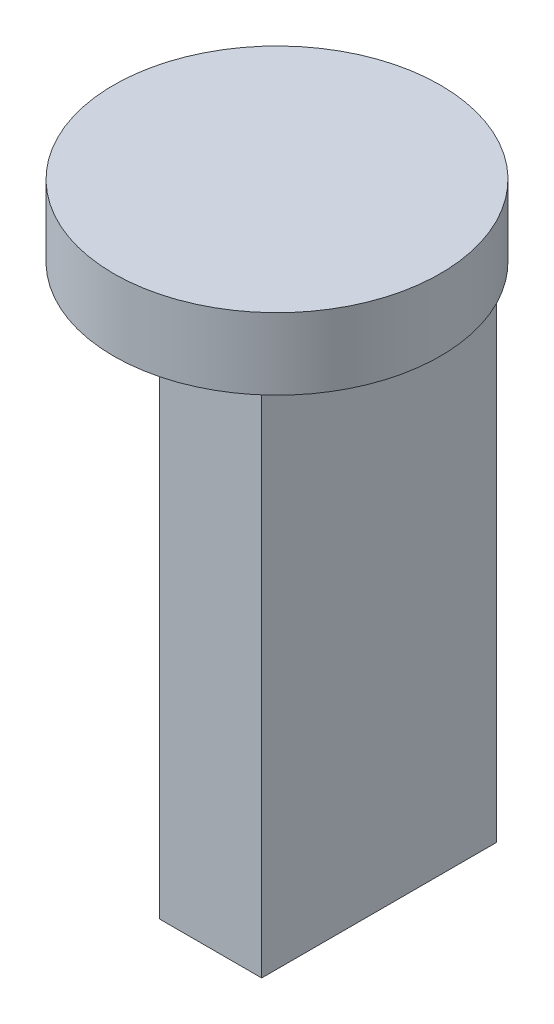
ISO-10303-21;
HEADER;
FILE_DESCRIPTION(('STEP AP214'),'2;1');
FILE_NAME('part.step','',(''),(''),'','','');
FILE_SCHEMA(('AUTOMOTIVE_DESIGN { 1 0 10303 214 1 1 1 1 }'));
ENDSEC;
DATA;
#1=APPLICATION_CONTEXT('core data for automotive mechanical design processes');
#2=APPLICATION_PROTOCOL_DEFINITION('international standard','automotive_design',2000,#1);
#3=PRODUCT_CONTEXT('',#1,'mechanical');
#4=PRODUCT('Part','Part','',(#3));
#5=PRODUCT_RELATED_PRODUCT_CATEGORY('part','',(#4));
#6=PRODUCT_DEFINITION_FORMATION('','',#4);
#7=PRODUCT_DEFINITION_CONTEXT('part definition',#1,'design');
#8=PRODUCT_DEFINITION('design','',#6,#7);
#9=PRODUCT_DEFINITION_SHAPE('','',#8);
#10=(LENGTH_UNIT() NAMED_UNIT(*) SI_UNIT(.MILLI.,.METRE.));
#11=(NAMED_UNIT(*) PLANE_ANGLE_UNIT() SI_UNIT($,.RADIAN.));
#12=(NAMED_UNIT(*) SI_UNIT($,.STERADIAN.) SOLID_ANGLE_UNIT());
#13=UNCERTAINTY_MEASURE_WITH_UNIT(LENGTH_MEASURE(1.E-05),#10,'distance_accuracy_value','');
#14=(GEOMETRIC_REPRESENTATION_CONTEXT(3) GLOBAL_UNCERTAINTY_ASSIGNED_CONTEXT((#13)) GLOBAL_UNIT_ASSIGNED_CONTEXT((#10,
#11,#12)) REPRESENTATION_CONTEXT('',''));
#15=CARTESIAN_POINT('',(0.,0.,0.));
#16=DIRECTION('',(0.,0.,1.));
#17=DIRECTION('',(1.,0.,0.));
#18=AXIS2_PLACEMENT_3D('',#15,#16,#17);
#19=CARTESIAN_POINT('',(0.,250.,-25.));
#20=DIRECTION('',(0.,0.,1.));
#21=DIRECTION('',(1.,0.,0.));
#22=AXIS2_PLACEMENT_3D('',#19,#20,#21);
#23=PLANE('',#22);
#24=DIRECTION('',(-1.,0.,0.));
#25=VECTOR('',#24,1.);
#26=CARTESIAN_POINT('',(0.,0.,-25.));
#27=LINE('',#26,#25);
#28=CARTESIAN_POINT('',(-25.,0.,-25.));
#29=VERTEX_POINT('',#28);
#30=CARTESIAN_POINT('',(-40.,0.,-25.));
#31=VERTEX_POINT('',#30);
#32=EDGE_CURVE('E100',#29,#31,#27,.T.);
#33=ORIENTED_EDGE('',*,*,#32,.T.);
#34=DIRECTION('',(0.,-1.,0.));
#35=VECTOR('',#34,1.);
#36=CARTESIAN_POINT('',(-40.,250.,-25.));
#37=LINE('',#36,#35);
#38=CARTESIAN_POINT('',(-40.,250.,-25.));
#39=VERTEX_POINT('',#38);
#40=EDGE_CURVE('E11',#39,#31,#37,.T.);
#41=ORIENTED_EDGE('',*,*,#40,.F.);
#42=DIRECTION('',(-1.,0.,0.));
#43=VECTOR('',#42,1.);
#44=CARTESIAN_POINT('',(0.,250.,-25.));
#45=LINE('',#44,#43);
#46=CARTESIAN_POINT('',(-25.,250.,-25.));
#47=VERTEX_POINT('',#46);
#48=EDGE_CURVE('E101',#47,#39,#45,.T.);
#49=ORIENTED_EDGE('',*,*,#48,.F.);
#50=DIRECTION('',(0.,-1.,0.));
#51=VECTOR('',#50,1.);
#52=CARTESIAN_POINT('',(-25.,250.,-25.));
#53=LINE('',#52,#51);
#54=EDGE_CURVE('E86',#47,#29,#53,.T.);
#55=ORIENTED_EDGE('',*,*,#54,.T.);
#56=EDGE_LOOP('',(#33,#41,#49,#55));
#57=FACE_BOUND('',#56,.T.);
#58=ADVANCED_FACE('F33',(#57),#23,.F.);
#59=CARTESIAN_POINT('',(-40.,250.,0.));
#60=DIRECTION('',(1.,0.,0.));
#61=DIRECTION('',(0.,0.,-1.));
#62=AXIS2_PLACEMENT_3D('',#59,#60,#61);
#63=PLANE('',#62);
#64=DIRECTION('',(0.,0.,1.));
#65=VECTOR('',#64,1.);
#66=CARTESIAN_POINT('',(-40.,0.,0.));
#67=LINE('',#66,#65);
#68=CARTESIAN_POINT('',(-40.,0.,25.));
#69=VERTEX_POINT('',#68);
#70=EDGE_CURVE('E115',#31,#69,#67,.T.);
#71=ORIENTED_EDGE('',*,*,#70,.T.);
#72=DIRECTION('',(0.,-1.,0.));
#73=VECTOR('',#72,1.);
#74=CARTESIAN_POINT('',(-40.,250.,25.));
#75=LINE('',#74,#73);
#76=CARTESIAN_POINT('',(-40.,250.,25.));
#77=VERTEX_POINT('',#76);
#78=EDGE_CURVE('E41',#77,#69,#75,.T.);
#79=ORIENTED_EDGE('',*,*,#78,.F.);
#80=DIRECTION('',(0.,0.,1.));
#81=VECTOR('',#80,1.);
#82=CARTESIAN_POINT('',(-40.,250.,0.));
#83=LINE('',#82,#81);
#84=EDGE_CURVE('E105',#39,#77,#83,.T.);
#85=ORIENTED_EDGE('',*,*,#84,.F.);
#86=ORIENTED_EDGE('',*,*,#40,.T.);
#87=EDGE_LOOP('',(#71,#79,#85,#86));
#88=FACE_BOUND('',#87,.T.);
#89=ADVANCED_FACE('F163',(#88),#63,.F.);
#90=CARTESIAN_POINT('',(0.,250.,25.));
#91=DIRECTION('',(0.,0.,1.));
#92=DIRECTION('',(1.,0.,0.));
#93=AXIS2_PLACEMENT_3D('',#90,#91,#92);
#94=PLANE('',#93);
#95=DIRECTION('',(-1.,0.,0.));
#96=VECTOR('',#95,1.);
#97=CARTESIAN_POINT('',(0.,0.,25.));
#98=LINE('',#97,#96);
#99=CARTESIAN_POINT('',(-25.,0.,25.));
#100=VERTEX_POINT('',#99);
#101=EDGE_CURVE('E111',#100,#69,#98,.T.);
#102=ORIENTED_EDGE('',*,*,#101,.F.);
#103=DIRECTION('',(0.,-1.,0.));
#104=VECTOR('',#103,1.);
#105=CARTESIAN_POINT('',(-25.,250.,25.));
#106=LINE('',#105,#104);
#107=CARTESIAN_POINT('',(-25.,250.,25.));
#108=VERTEX_POINT('',#107);
#109=EDGE_CURVE('E187',#108,#100,#106,.T.);
#110=ORIENTED_EDGE('',*,*,#109,.F.);
#111=DIRECTION('',(-1.,0.,0.));
#112=VECTOR('',#111,1.);
#113=CARTESIAN_POINT('',(0.,250.,25.));
#114=LINE('',#113,#112);
#115=EDGE_CURVE('E131',#108,#77,#114,.T.);
#116=ORIENTED_EDGE('',*,*,#115,.T.);
#117=ORIENTED_EDGE('',*,*,#78,.T.);
#118=EDGE_LOOP('',(#102,#110,#116,#117));
#119=FACE_BOUND('',#118,.T.);
#120=ADVANCED_FACE('F189',(#119),#94,.T.);
#121=CARTESIAN_POINT('',(-25.,250.,0.));
#122=DIRECTION('',(-1.,0.,0.));
#123=DIRECTION('',(0.,0.,1.));
#124=AXIS2_PLACEMENT_3D('',#121,#122,#123);
#125=PLANE('',#124);
#126=DIRECTION('',(0.,0.,-1.));
#127=VECTOR('',#126,1.);
#128=CARTESIAN_POINT('',(-25.,0.,0.));
#129=LINE('',#128,#127);
#130=CARTESIAN_POINT('',(-25.,0.,57.5));
#131=VERTEX_POINT('',#130);
#132=EDGE_CURVE('E103',#131,#100,#129,.T.);
#133=ORIENTED_EDGE('',*,*,#132,.F.);
#134=DIRECTION('',(0.,-1.,0.));
#135=VECTOR('',#134,1.);
#136=CARTESIAN_POINT('',(-25.,250.,57.5));
#137=LINE('',#136,#135);
#138=CARTESIAN_POINT('',(-25.,250.,57.5));
#139=VERTEX_POINT('',#138);
#140=EDGE_CURVE('E183',#139,#131,#137,.T.);
#141=ORIENTED_EDGE('',*,*,#140,.F.);
#142=DIRECTION('',(0.,0.,-1.));
#143=VECTOR('',#142,1.);
#144=CARTESIAN_POINT('',(-25.,250.,0.));
#145=LINE('',#144,#143);
#146=EDGE_CURVE('E128',#139,#108,#145,.T.);
#147=ORIENTED_EDGE('',*,*,#146,.T.);
#148=ORIENTED_EDGE('',*,*,#109,.T.);
#149=EDGE_LOOP('',(#133,#141,#147,#148));
#150=FACE_BOUND('',#149,.T.);
#151=ADVANCED_FACE('F192',(#150),#125,.T.);
#152=CARTESIAN_POINT('',(0.,250.,57.5));
#153=DIRECTION('',(0.,0.,-1.));
#154=DIRECTION('',(-1.,0.,0.));
#155=AXIS2_PLACEMENT_3D('',#152,#153,#154);
#156=PLANE('',#155);
#157=DIRECTION('',(1.,0.,0.));
#158=VECTOR('',#157,1.);
#159=CARTESIAN_POINT('',(0.,0.,57.5));
#160=LINE('',#159,#158);
#161=CARTESIAN_POINT('',(25.,0.,57.5));
#162=VERTEX_POINT('',#161);
#163=EDGE_CURVE('E110',#131,#162,#160,.T.);
#164=ORIENTED_EDGE('',*,*,#163,.T.);
#165=DIRECTION('',(0.,-1.,0.));
#166=VECTOR('',#165,1.);
#167=CARTESIAN_POINT('',(25.,250.,57.5));
#168=LINE('',#167,#166);
#169=CARTESIAN_POINT('',(25.,250.,57.5));
#170=VERTEX_POINT('',#169);
#171=EDGE_CURVE('E181',#170,#162,#168,.T.);
#172=ORIENTED_EDGE('',*,*,#171,.F.);
#173=DIRECTION('',(1.,0.,0.));
#174=VECTOR('',#173,1.);
#175=CARTESIAN_POINT('',(0.,250.,57.5));
#176=LINE('',#175,#174);
#177=EDGE_CURVE('E125',#139,#170,#176,.T.);
#178=ORIENTED_EDGE('',*,*,#177,.F.);
#179=ORIENTED_EDGE('',*,*,#140,.T.);
#180=EDGE_LOOP('',(#164,#172,#178,#179));
#181=FACE_BOUND('',#180,.T.);
#182=ADVANCED_FACE('F194',(#181),#156,.F.);
#183=CARTESIAN_POINT('',(25.,250.,0.));
#184=DIRECTION('',(-1.,0.,0.));
#185=DIRECTION('',(0.,0.,1.));
#186=AXIS2_PLACEMENT_3D('',#183,#184,#185);
#187=PLANE('',#186);
#188=DIRECTION('',(0.,0.,-1.));
#189=VECTOR('',#188,1.);
#190=CARTESIAN_POINT('',(25.,0.,0.));
#191=LINE('',#190,#189);
#192=CARTESIAN_POINT('',(25.,0.,-57.5));
#193=VERTEX_POINT('',#192);
#194=EDGE_CURVE('E95',#162,#193,#191,.T.);
#195=ORIENTED_EDGE('',*,*,#194,.T.);
#196=DIRECTION('',(0.,-1.,0.));
#197=VECTOR('',#196,1.);
#198=CARTESIAN_POINT('',(25.,250.,-57.5));
#199=LINE('',#198,#197);
#200=CARTESIAN_POINT('',(25.,250.,-57.5));
#201=VERTEX_POINT('',#200);
#202=EDGE_CURVE('E85',#201,#193,#199,.T.);
#203=ORIENTED_EDGE('',*,*,#202,.F.);
#204=DIRECTION('',(0.,0.,-1.));
#205=VECTOR('',#204,1.);
#206=CARTESIAN_POINT('',(25.,250.,0.));
#207=LINE('',#206,#205);
#208=EDGE_CURVE('E123',#170,#201,#207,.T.);
#209=ORIENTED_EDGE('',*,*,#208,.F.);
#210=ORIENTED_EDGE('',*,*,#171,.T.);
#211=EDGE_LOOP('',(#195,#203,#209,#210));
#212=FACE_BOUND('',#211,.T.);
#213=ADVANCED_FACE('F180',(#212),#187,.F.);
#214=CARTESIAN_POINT('',(0.,250.,-57.5));
#215=DIRECTION('',(0.,0.,-1.));
#216=DIRECTION('',(-1.,0.,0.));
#217=AXIS2_PLACEMENT_3D('',#214,#215,#216);
#218=PLANE('',#217);
#219=DIRECTION('',(1.,0.,0.));
#220=VECTOR('',#219,1.);
#221=CARTESIAN_POINT('',(0.,0.,-57.5));
#222=LINE('',#221,#220);
#223=CARTESIAN_POINT('',(-25.,0.,-57.5));
#224=VERTEX_POINT('',#223);
#225=EDGE_CURVE('E89',#224,#193,#222,.T.);
#226=ORIENTED_EDGE('',*,*,#225,.F.);
#227=DIRECTION('',(0.,-1.,0.));
#228=VECTOR('',#227,1.);
#229=CARTESIAN_POINT('',(-25.,250.,-57.5));
#230=LINE('',#229,#228);
#231=CARTESIAN_POINT('',(-25.,250.,-57.5));
#232=VERTEX_POINT('',#231);
#233=EDGE_CURVE('E77',#232,#224,#230,.T.);
#234=ORIENTED_EDGE('',*,*,#233,.F.);
#235=DIRECTION('',(1.,0.,0.));
#236=VECTOR('',#235,1.);
#237=CARTESIAN_POINT('',(0.,250.,-57.5));
#238=LINE('',#237,#236);
#239=EDGE_CURVE('E48',#232,#201,#238,.T.);
#240=ORIENTED_EDGE('',*,*,#239,.T.);
#241=ORIENTED_EDGE('',*,*,#202,.T.);
#242=EDGE_LOOP('',(#226,#234,#240,#241));
#243=FACE_BOUND('',#242,.T.);
#244=ADVANCED_FACE('F90',(#243),#218,.T.);
#245=EDGE_CURVE('E82',#29,#224,#129,.T.);
#246=ORIENTED_EDGE('',*,*,#245,.F.);
#247=ORIENTED_EDGE('',*,*,#54,.F.);
#248=EDGE_CURVE('E83',#47,#232,#145,.T.);
#249=ORIENTED_EDGE('',*,*,#248,.T.);
#250=ORIENTED_EDGE('',*,*,#233,.T.);
#251=EDGE_LOOP('',(#246,#247,#249,#250));
#252=FACE_BOUND('',#251,.T.);
#253=ADVANCED_FACE('F79',(#252),#125,.T.);
#254=CARTESIAN_POINT('',(0.,0.,0.));
#255=DIRECTION('',(0.,1.,0.));
#256=DIRECTION('',(0.,0.,1.));
#257=AXIS2_PLACEMENT_3D('',#254,#255,#256);
#258=PLANE('',#257);
#259=ORIENTED_EDGE('',*,*,#32,.F.);
#260=ORIENTED_EDGE('',*,*,#245,.T.);
#261=ORIENTED_EDGE('',*,*,#225,.T.);
#262=ORIENTED_EDGE('',*,*,#194,.F.);
#263=ORIENTED_EDGE('',*,*,#163,.F.);
#264=ORIENTED_EDGE('',*,*,#132,.T.);
#265=ORIENTED_EDGE('',*,*,#101,.T.);
#266=ORIENTED_EDGE('',*,*,#70,.F.);
#267=EDGE_LOOP('',(#259,#260,#261,#262,#263,#264,#265,#266));
#268=FACE_BOUND('',#267,.T.);
#269=ADVANCED_FACE('F98',(#268),#258,.F.);
#270=CARTESIAN_POINT('',(-25.,250.,0.));
#271=DIRECTION('',(0.,1.,0.));
#272=DIRECTION('',(0.,0.,1.));
#273=AXIS2_PLACEMENT_3D('',#270,#271,#272);
#274=PLANE('',#273);
#275=CARTESIAN_POINT('',(-25.,250.,0.));
#276=DIRECTION('',(0.,1.,0.));
#277=DIRECTION('',(0.,0.,1.));
#278=AXIS2_PLACEMENT_3D('',#275,#276,#277);
#279=CIRCLE('',#278,80.);
#280=CARTESIAN_POINT('',(-25.,250.,80.));
#281=VERTEX_POINT('',#280);
#282=EDGE_CURVE('E136',#281,#281,#279,.T.);
#283=ORIENTED_EDGE('',*,*,#282,.F.);
#284=EDGE_LOOP('',(#283));
#285=FACE_BOUND('',#284,.T.);
#286=ORIENTED_EDGE('',*,*,#248,.F.);
#287=ORIENTED_EDGE('',*,*,#48,.T.);
#288=ORIENTED_EDGE('',*,*,#84,.T.);
#289=ORIENTED_EDGE('',*,*,#115,.F.);
#290=ORIENTED_EDGE('',*,*,#146,.F.);
#291=ORIENTED_EDGE('',*,*,#177,.T.);
#292=ORIENTED_EDGE('',*,*,#208,.T.);
#293=ORIENTED_EDGE('',*,*,#239,.F.);
#294=EDGE_LOOP('',(#286,#287,#288,#289,#290,#291,#292,#293));
#295=FACE_BOUND('',#294,.T.);
#296=ADVANCED_FACE('F147',(#285,#295),#274,.F.);
#297=CARTESIAN_POINT('',(-25.,285.,0.));
#298=DIRECTION('',(0.,-1.,0.));
#299=DIRECTION('',(0.,0.,-1.));
#300=AXIS2_PLACEMENT_3D('',#297,#298,#299);
#301=CYLINDRICAL_SURFACE('',#300,80.);
#302=CARTESIAN_POINT('',(-25.,285.,0.));
#303=DIRECTION('',(0.,1.,0.));
#304=DIRECTION('',(0.,0.,1.));
#305=AXIS2_PLACEMENT_3D('',#302,#303,#304);
#306=CIRCLE('',#305,80.);
#307=CARTESIAN_POINT('',(-25.,285.,80.));
#308=VERTEX_POINT('',#307);
#309=EDGE_CURVE('E121',#308,#308,#306,.T.);
#310=ORIENTED_EDGE('',*,*,#309,.F.);
#311=EDGE_LOOP('',(#310));
#312=FACE_BOUND('',#311,.T.);
#313=ORIENTED_EDGE('',*,*,#282,.T.);
#314=EDGE_LOOP('',(#313));
#315=FACE_BOUND('',#314,.T.);
#316=ADVANCED_FACE('F144',(#312,#315),#301,.T.);
#317=CARTESIAN_POINT('',(-25.,285.,0.));
#318=DIRECTION('',(0.,1.,0.));
#319=DIRECTION('',(0.,0.,1.));
#320=AXIS2_PLACEMENT_3D('',#317,#318,#319);
#321=PLANE('',#320);
#322=ORIENTED_EDGE('',*,*,#309,.T.);
#323=EDGE_LOOP('',(#322));
#324=FACE_BOUND('',#323,.T.);
#325=ADVANCED_FACE('F142',(#324),#321,.T.);
#326=CLOSED_SHELL('',(#58,#89,#120,#151,#182,#213,#244,#253,#269,#296,#316,#325));
#327=MANIFOLD_SOLID_BREP('B2',#326);
#328=ADVANCED_BREP_SHAPE_REPRESENTATION('',(#18,#327),#14);
#329=SHAPE_DEFINITION_REPRESENTATION(#9,#328);
ENDSEC;
END-ISO-10303-21;
